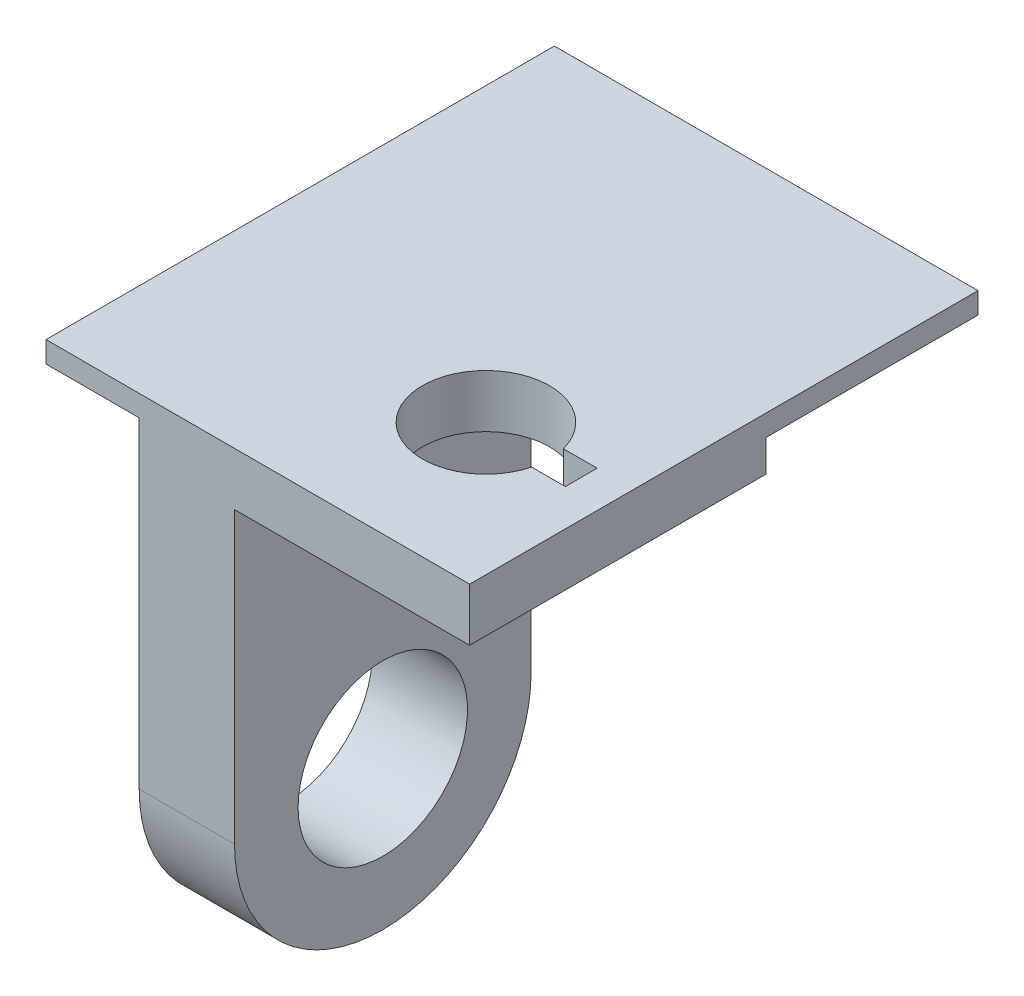
ISO-10303-21;
HEADER;
FILE_DESCRIPTION(('STEP AP214'),'2;1');
FILE_NAME('part.step','',(''),(''),'','','');
FILE_SCHEMA(('AUTOMOTIVE_DESIGN { 1 0 10303 214 1 1 1 1 }'));
ENDSEC;
DATA;
#1=APPLICATION_CONTEXT('core data for automotive mechanical design processes');
#2=APPLICATION_PROTOCOL_DEFINITION('international standard','automotive_design',2000,#1);
#3=PRODUCT_CONTEXT('',#1,'mechanical');
#4=PRODUCT('Part','Part','',(#3));
#5=PRODUCT_RELATED_PRODUCT_CATEGORY('part','',(#4));
#6=PRODUCT_DEFINITION_FORMATION('','',#4);
#7=PRODUCT_DEFINITION_CONTEXT('part definition',#1,'design');
#8=PRODUCT_DEFINITION('design','',#6,#7);
#9=PRODUCT_DEFINITION_SHAPE('','',#8);
#10=(LENGTH_UNIT() NAMED_UNIT(*) SI_UNIT(.MILLI.,.METRE.));
#11=(NAMED_UNIT(*) PLANE_ANGLE_UNIT() SI_UNIT($,.RADIAN.));
#12=(NAMED_UNIT(*) SI_UNIT($,.STERADIAN.) SOLID_ANGLE_UNIT());
#13=UNCERTAINTY_MEASURE_WITH_UNIT(LENGTH_MEASURE(1.E-05),#10,'distance_accuracy_value','');
#14=(GEOMETRIC_REPRESENTATION_CONTEXT(3) GLOBAL_UNCERTAINTY_ASSIGNED_CONTEXT((#13)) GLOBAL_UNIT_ASSIGNED_CONTEXT((#10,
#11,#12)) REPRESENTATION_CONTEXT('',''));
#15=CARTESIAN_POINT('',(0.,0.,0.));
#16=DIRECTION('',(0.,0.,1.));
#17=DIRECTION('',(1.,0.,0.));
#18=AXIS2_PLACEMENT_3D('',#15,#16,#17);
#19=CARTESIAN_POINT('',(0.,0.,0.));
#20=DIRECTION('',(1.,0.,0.));
#21=DIRECTION('',(0.,0.,-1.));
#22=AXIS2_PLACEMENT_3D('',#19,#20,#21);
#23=PLANE('',#22);
#24=CARTESIAN_POINT('',(0.,0.,0.));
#25=DIRECTION('',(1.,0.,0.));
#26=DIRECTION('',(0.,0.,-1.));
#27=AXIS2_PLACEMENT_3D('',#24,#25,#26);
#28=CIRCLE('',#27,40.);
#29=CARTESIAN_POINT('',(0.,0.,40.));
#30=VERTEX_POINT('',#29);
#31=EDGE_CURVE('E206',#30,#30,#28,.T.);
#32=ORIENTED_EDGE('',*,*,#31,.T.);
#33=EDGE_LOOP('',(#32));
#34=FACE_BOUND('',#33,.T.);
#35=DIRECTION('',(0.,0.,1.));
#36=VECTOR('',#35,1.);
#37=CARTESIAN_POINT('',(0.,151.8,0.));
#38=LINE('',#37,#36);
#39=CARTESIAN_POINT('',(0.,151.8,-70.));
#40=VERTEX_POINT('',#39);
#41=CARTESIAN_POINT('',(0.,151.8,70.));
#42=VERTEX_POINT('',#41);
#43=EDGE_CURVE('E57',#40,#42,#38,.T.);
#44=ORIENTED_EDGE('',*,*,#43,.F.);
#45=DIRECTION('',(0.,1.,0.));
#46=VECTOR('',#45,1.);
#47=CARTESIAN_POINT('',(0.,136.8,-70.));
#48=LINE('',#47,#46);
#49=CARTESIAN_POINT('',(0.,0.,-70.));
#50=VERTEX_POINT('',#49);
#51=EDGE_CURVE('E228',#50,#40,#48,.T.);
#52=ORIENTED_EDGE('',*,*,#51,.F.);
#53=CARTESIAN_POINT('',(0.,0.,0.));
#54=DIRECTION('',(1.,0.,0.));
#55=DIRECTION('',(0.,0.,-1.));
#56=AXIS2_PLACEMENT_3D('',#53,#54,#55);
#57=CIRCLE('',#56,70.);
#58=CARTESIAN_POINT('',(0.,0.,70.));
#59=VERTEX_POINT('',#58);
#60=EDGE_CURVE('E210',#59,#50,#57,.T.);
#61=ORIENTED_EDGE('',*,*,#60,.F.);
#62=DIRECTION('',(0.,-1.,0.));
#63=VECTOR('',#62,1.);
#64=CARTESIAN_POINT('',(0.,0.,70.));
#65=LINE('',#64,#63);
#66=EDGE_CURVE('E217',#42,#59,#65,.T.);
#67=ORIENTED_EDGE('',*,*,#66,.F.);
#68=EDGE_LOOP('',(#44,#52,#61,#67));
#69=FACE_BOUND('',#68,.T.);
#70=ADVANCED_FACE('F34',(#34,#69),#23,.F.);
#71=CARTESIAN_POINT('',(45.,136.8,-70.));
#72=DIRECTION('',(0.,0.,1.));
#73=DIRECTION('',(1.,0.,0.));
#74=AXIS2_PLACEMENT_3D('',#71,#72,#73);
#75=PLANE('',#74);
#76=DIRECTION('',(-1.,0.,0.));
#77=VECTOR('',#76,1.);
#78=CARTESIAN_POINT('',(0.,151.8,-70.));
#79=LINE('',#78,#77);
#80=CARTESIAN_POINT('',(156.,151.8,-70.));
#81=VERTEX_POINT('',#80);
#82=EDGE_CURVE('E169',#81,#40,#79,.T.);
#83=ORIENTED_EDGE('',*,*,#82,.F.);
#84=DIRECTION('',(0.,-1.,0.));
#85=VECTOR('',#84,1.);
#86=CARTESIAN_POINT('',(156.,161.8,-70.));
#87=LINE('',#86,#85);
#88=CARTESIAN_POINT('',(156.,136.8,-70.));
#89=VERTEX_POINT('',#88);
#90=EDGE_CURVE('E195',#81,#89,#87,.T.);
#91=ORIENTED_EDGE('',*,*,#90,.T.);
#92=DIRECTION('',(-1.,0.,0.));
#93=VECTOR('',#92,1.);
#94=CARTESIAN_POINT('',(0.,136.8,-70.));
#95=LINE('',#94,#93);
#96=CARTESIAN_POINT('',(45.,136.8,-70.));
#97=VERTEX_POINT('',#96);
#98=EDGE_CURVE('E193',#89,#97,#95,.T.);
#99=ORIENTED_EDGE('',*,*,#98,.T.);
#100=DIRECTION('',(0.,1.,0.));
#101=VECTOR('',#100,1.);
#102=CARTESIAN_POINT('',(45.,136.8,-70.));
#103=LINE('',#102,#101);
#104=CARTESIAN_POINT('',(45.,0.,-70.));
#105=VERTEX_POINT('',#104);
#106=EDGE_CURVE('E216',#105,#97,#103,.T.);
#107=ORIENTED_EDGE('',*,*,#106,.F.);
#108=DIRECTION('',(-1.,0.,0.));
#109=VECTOR('',#108,1.);
#110=CARTESIAN_POINT('',(45.,0.,-70.));
#111=LINE('',#110,#109);
#112=EDGE_CURVE('E233',#105,#50,#111,.T.);
#113=ORIENTED_EDGE('',*,*,#112,.T.);
#114=ORIENTED_EDGE('',*,*,#51,.T.);
#115=EDGE_LOOP('',(#83,#91,#99,#107,#113,#114));
#116=FACE_BOUND('',#115,.T.);
#117=ADVANCED_FACE('F238',(#116),#75,.F.);
#118=CARTESIAN_POINT('',(45.,0.,0.));
#119=DIRECTION('',(1.,0.,0.));
#120=DIRECTION('',(0.,0.,-1.));
#121=AXIS2_PLACEMENT_3D('',#118,#119,#120);
#122=PLANE('',#121);
#123=CARTESIAN_POINT('',(45.,0.,0.));
#124=DIRECTION('',(1.,0.,0.));
#125=DIRECTION('',(0.,0.,-1.));
#126=AXIS2_PLACEMENT_3D('',#123,#124,#125);
#127=CIRCLE('',#126,70.);
#128=CARTESIAN_POINT('',(45.,0.,70.));
#129=VERTEX_POINT('',#128);
#130=EDGE_CURVE('E213',#129,#105,#127,.T.);
#131=ORIENTED_EDGE('',*,*,#130,.T.);
#132=ORIENTED_EDGE('',*,*,#106,.T.);
#133=DIRECTION('',(0.,0.,1.));
#134=VECTOR('',#133,1.);
#135=CARTESIAN_POINT('',(45.,136.8,70.));
#136=LINE('',#135,#134);
#137=CARTESIAN_POINT('',(45.,136.8,70.));
#138=VERTEX_POINT('',#137);
#139=EDGE_CURVE('E220',#97,#138,#136,.T.);
#140=ORIENTED_EDGE('',*,*,#139,.T.);
#141=DIRECTION('',(0.,-1.,0.));
#142=VECTOR('',#141,1.);
#143=CARTESIAN_POINT('',(45.,0.,70.));
#144=LINE('',#143,#142);
#145=EDGE_CURVE('E223',#138,#129,#144,.T.);
#146=ORIENTED_EDGE('',*,*,#145,.T.);
#147=EDGE_LOOP('',(#131,#132,#140,#146));
#148=FACE_BOUND('',#147,.T.);
#149=CARTESIAN_POINT('',(45.,0.,0.));
#150=DIRECTION('',(1.,0.,0.));
#151=DIRECTION('',(0.,0.,-1.));
#152=AXIS2_PLACEMENT_3D('',#149,#150,#151);
#153=CIRCLE('',#152,40.);
#154=CARTESIAN_POINT('',(45.,0.,40.));
#155=VERTEX_POINT('',#154);
#156=EDGE_CURVE('E207',#155,#155,#153,.T.);
#157=ORIENTED_EDGE('',*,*,#156,.F.);
#158=EDGE_LOOP('',(#157));
#159=FACE_BOUND('',#158,.T.);
#160=ADVANCED_FACE('F267',(#148,#159),#122,.T.);
#161=CARTESIAN_POINT('',(45.,0.,0.));
#162=DIRECTION('',(-1.,0.,0.));
#163=DIRECTION('',(0.,0.,1.));
#164=AXIS2_PLACEMENT_3D('',#161,#162,#163);
#165=CYLINDRICAL_SURFACE('',#164,70.);
#166=ORIENTED_EDGE('',*,*,#60,.T.);
#167=ORIENTED_EDGE('',*,*,#112,.F.);
#168=ORIENTED_EDGE('',*,*,#130,.F.);
#169=DIRECTION('',(-1.,0.,0.));
#170=VECTOR('',#169,1.);
#171=CARTESIAN_POINT('',(45.,0.,70.));
#172=LINE('',#171,#170);
#173=EDGE_CURVE('E225',#129,#59,#172,.T.);
#174=ORIENTED_EDGE('',*,*,#173,.T.);
#175=EDGE_LOOP('',(#166,#167,#168,#174));
#176=FACE_BOUND('',#175,.T.);
#177=ADVANCED_FACE('F36',(#176),#165,.T.);
#178=CARTESIAN_POINT('',(45.,0.,70.));
#179=DIRECTION('',(0.,0.,-1.));
#180=DIRECTION('',(-1.,0.,0.));
#181=AXIS2_PLACEMENT_3D('',#178,#179,#180);
#182=PLANE('',#181);
#183=DIRECTION('',(1.,0.,0.));
#184=VECTOR('',#183,1.);
#185=CARTESIAN_POINT('',(0.,161.8,70.));
#186=LINE('',#185,#184);
#187=CARTESIAN_POINT('',(-44.,161.8,70.));
#188=VERTEX_POINT('',#187);
#189=CARTESIAN_POINT('',(156.,161.8,70.));
#190=VERTEX_POINT('',#189);
#191=EDGE_CURVE('E190',#188,#190,#186,.T.);
#192=ORIENTED_EDGE('',*,*,#191,.F.);
#193=DIRECTION('',(0.,1.,0.));
#194=VECTOR('',#193,1.);
#195=CARTESIAN_POINT('',(-44.,151.8,70.));
#196=LINE('',#195,#194);
#197=CARTESIAN_POINT('',(-44.,151.8,70.));
#198=VERTEX_POINT('',#197);
#199=EDGE_CURVE('E177',#198,#188,#196,.T.);
#200=ORIENTED_EDGE('',*,*,#199,.F.);
#201=DIRECTION('',(-1.,0.,0.));
#202=VECTOR('',#201,1.);
#203=CARTESIAN_POINT('',(0.,151.8,70.));
#204=LINE('',#203,#202);
#205=EDGE_CURVE('E166',#42,#198,#204,.T.);
#206=ORIENTED_EDGE('',*,*,#205,.F.);
#207=ORIENTED_EDGE('',*,*,#66,.T.);
#208=ORIENTED_EDGE('',*,*,#173,.F.);
#209=ORIENTED_EDGE('',*,*,#145,.F.);
#210=DIRECTION('',(1.,0.,0.));
#211=VECTOR('',#210,1.);
#212=CARTESIAN_POINT('',(0.,136.8,70.));
#213=LINE('',#212,#211);
#214=CARTESIAN_POINT('',(156.,136.8,70.));
#215=VERTEX_POINT('',#214);
#216=EDGE_CURVE('E187',#138,#215,#213,.T.);
#217=ORIENTED_EDGE('',*,*,#216,.T.);
#218=DIRECTION('',(0.,-1.,0.));
#219=VECTOR('',#218,1.);
#220=CARTESIAN_POINT('',(156.,161.8,70.));
#221=LINE('',#220,#219);
#222=EDGE_CURVE('E203',#190,#215,#221,.T.);
#223=ORIENTED_EDGE('',*,*,#222,.F.);
#224=EDGE_LOOP('',(#192,#200,#206,#207,#208,#209,#217,#223));
#225=FACE_BOUND('',#224,.T.);
#226=ADVANCED_FACE('F248',(#225),#182,.F.);
#227=CARTESIAN_POINT('',(45.,0.,0.));
#228=DIRECTION('',(-1.,0.,0.));
#229=DIRECTION('',(0.,0.,1.));
#230=AXIS2_PLACEMENT_3D('',#227,#228,#229);
#231=CYLINDRICAL_SURFACE('',#230,40.);
#232=CARTESIAN_POINT('',(45.,0.,40.));
#233=CARTESIAN_POINT('',(44.53125,0.,40.));
#234=CARTESIAN_POINT('',(44.0625,0.,40.));
#235=CARTESIAN_POINT('',(43.125,0.,40.));
#236=CARTESIAN_POINT('',(42.65625,0.,40.));
#237=CARTESIAN_POINT('',(41.71875,0.,40.));
#238=CARTESIAN_POINT('',(41.25,0.,40.));
#239=CARTESIAN_POINT('',(40.3125,0.,40.));
#240=CARTESIAN_POINT('',(39.84375,0.,40.));
#241=CARTESIAN_POINT('',(38.90625,0.,40.));
#242=CARTESIAN_POINT('',(38.4375,0.,40.));
#243=CARTESIAN_POINT('',(37.5,0.,40.));
#244=CARTESIAN_POINT('',(37.03125,0.,40.));
#245=CARTESIAN_POINT('',(36.09375,0.,40.));
#246=CARTESIAN_POINT('',(35.625,0.,40.));
#247=CARTESIAN_POINT('',(34.6875,0.,40.));
#248=CARTESIAN_POINT('',(34.21875,0.,40.));
#249=CARTESIAN_POINT('',(33.28125,0.,40.));
#250=CARTESIAN_POINT('',(32.8125,0.,40.));
#251=CARTESIAN_POINT('',(31.875,0.,40.));
#252=CARTESIAN_POINT('',(31.40625,0.,40.));
#253=CARTESIAN_POINT('',(30.46875,0.,40.));
#254=CARTESIAN_POINT('',(30.,0.,40.));
#255=CARTESIAN_POINT('',(29.0625,0.,40.));
#256=CARTESIAN_POINT('',(28.59375,0.,40.));
#257=CARTESIAN_POINT('',(27.65625,0.,40.));
#258=CARTESIAN_POINT('',(27.1875,0.,40.));
#259=CARTESIAN_POINT('',(26.25,0.,40.));
#260=CARTESIAN_POINT('',(25.78125,0.,40.));
#261=CARTESIAN_POINT('',(24.84375,0.,40.));
#262=CARTESIAN_POINT('',(24.375,0.,40.));
#263=CARTESIAN_POINT('',(23.4375,0.,40.));
#264=CARTESIAN_POINT('',(22.96875,0.,40.));
#265=CARTESIAN_POINT('',(22.03125,0.,40.));
#266=CARTESIAN_POINT('',(21.5625,0.,40.));
#267=CARTESIAN_POINT('',(20.625,0.,40.));
#268=CARTESIAN_POINT('',(20.15625,0.,40.));
#269=CARTESIAN_POINT('',(19.21875,0.,40.));
#270=CARTESIAN_POINT('',(18.75,0.,40.));
#271=CARTESIAN_POINT('',(17.8125,0.,40.));
#272=CARTESIAN_POINT('',(17.34375,0.,40.));
#273=CARTESIAN_POINT('',(16.40625,0.,40.));
#274=CARTESIAN_POINT('',(15.9375,0.,40.));
#275=CARTESIAN_POINT('',(15.,0.,40.));
#276=CARTESIAN_POINT('',(14.53125,0.,40.));
#277=CARTESIAN_POINT('',(13.59375,0.,40.));
#278=CARTESIAN_POINT('',(13.125,0.,40.));
#279=CARTESIAN_POINT('',(12.1875,0.,40.));
#280=CARTESIAN_POINT('',(11.71875,0.,40.));
#281=CARTESIAN_POINT('',(10.78125,0.,40.));
#282=CARTESIAN_POINT('',(10.3125,0.,40.));
#283=CARTESIAN_POINT('',(9.375,0.,40.));
#284=CARTESIAN_POINT('',(8.90625,0.,40.));
#285=CARTESIAN_POINT('',(7.96874999999999,0.,40.));
#286=CARTESIAN_POINT('',(7.5,0.,40.));
#287=CARTESIAN_POINT('',(6.5625,0.,40.));
#288=CARTESIAN_POINT('',(6.09375,0.,40.));
#289=CARTESIAN_POINT('',(5.15625,0.,40.));
#290=CARTESIAN_POINT('',(4.68749999999999,0.,40.));
#291=CARTESIAN_POINT('',(3.74999999999999,0.,40.));
#292=CARTESIAN_POINT('',(3.28124999999999,0.,40.));
#293=CARTESIAN_POINT('',(2.34374999999999,0.,40.));
#294=CARTESIAN_POINT('',(1.87499999999999,0.,40.));
#295=CARTESIAN_POINT('',(0.937499999999992,0.,40.));
#296=CARTESIAN_POINT('',(0.468749999999993,0.,40.));
#297=CARTESIAN_POINT('',(0.,0.,40.));
#298=B_SPLINE_CURVE_WITH_KNOTS('',3,(#232,#233,#234,#235,#236,#237,#238,#239,#240,#241,#242,
#243,#244,#245,#246,#247,#248,#249,#250,#251,#252,#253,#254,#255,#256,#257,#258,#259,#260,#261,
#262,#263,#264,#265,#266,#267,#268,#269,#270,#271,#272,#273,#274,#275,#276,#277,#278,#279,#280,
#281,#282,#283,#284,#285,#286,#287,#288,#289,#290,#291,#292,#293,#294,#295,#296,#297),
.UNSPECIFIED.,.F.,.F.,(4,2,2,2,2,2,2,2,2,2,2,2,2,2,2,2,2,2,2,2,2,2,2,2,2,2,2,2,2,2,2,2,4),(0.,
1.40625,2.8125,4.21875000000001,5.62500000000001,7.03125,8.4375,9.84375000000001,11.25,12.65625,
14.0625,15.46875,16.875,18.28125,19.6875,21.09375,22.5,23.90625,25.3125,26.71875,28.125,
29.53125,30.9375,32.34375,33.75,35.15625,36.5625,37.96875,39.375,40.78125,42.1875,43.59375,45.),.UNSPECIFIED.);
#299=EDGE_CURVE('BSEAM302',#155,#30,#298,.T.);
#300=ORIENTED_EDGE('',*,*,#156,.T.);
#301=ORIENTED_EDGE('',*,*,#31,.F.);
#302=ORIENTED_EDGE('',*,*,#299,.T.);
#303=ORIENTED_EDGE('',*,*,#299,.F.);
#304=EDGE_LOOP('',(#300,#302,#301,#303));
#305=FACE_BOUND('',#304,.T.);
#306=ADVANCED_FACE('F302',(#305),#231,.F.);
#307=CARTESIAN_POINT('',(0.,161.8,0.));
#308=DIRECTION('',(0.,1.,0.));
#309=DIRECTION('',(0.,0.,1.));
#310=AXIS2_PLACEMENT_3D('',#307,#308,#309);
#311=PLANE('',#310);
#312=DIRECTION('',(-1.,0.,0.));
#313=VECTOR('',#312,1.);
#314=CARTESIAN_POINT('',(138.7,161.8,-7.50000000000054));
#315=LINE('',#314,#313);
#316=CARTESIAN_POINT('',(138.7,161.8,-7.50000000000054));
#317=VERTEX_POINT('',#316);
#318=CARTESIAN_POINT('',(122.747375096556,161.8,-7.50000000000053));
#319=VERTEX_POINT('',#318);
#320=EDGE_CURVE('E145',#317,#319,#315,.T.);
#321=ORIENTED_EDGE('',*,*,#320,.F.);
#322=DIRECTION('',(0.,0.,-1.));
#323=VECTOR('',#322,1.);
#324=CARTESIAN_POINT('',(138.7,161.8,-7.50000000000054));
#325=LINE('',#324,#323);
#326=CARTESIAN_POINT('',(138.7,161.8,7.49999999999946));
#327=VERTEX_POINT('',#326);
#328=EDGE_CURVE('E135',#327,#317,#325,.T.);
#329=ORIENTED_EDGE('',*,*,#328,.F.);
#330=DIRECTION('',(1.,0.,0.));
#331=VECTOR('',#330,1.);
#332=CARTESIAN_POINT('',(138.7,161.8,7.49999999999946));
#333=LINE('',#332,#331);
#334=CARTESIAN_POINT('',(122.747375096556,161.8,7.49999999999946));
#335=VERTEX_POINT('',#334);
#336=EDGE_CURVE('E127',#335,#327,#333,.T.);
#337=ORIENTED_EDGE('',*,*,#336,.F.);
#338=CARTESIAN_POINT('',(93.7,161.8,-4.69651297754447E-13));
#339=DIRECTION('',(0.,1.,0.));
#340=DIRECTION('',(0.,0.,1.));
#341=AXIS2_PLACEMENT_3D('',#338,#339,#340);
#342=CIRCLE('',#341,30.);
#343=EDGE_CURVE('E185',#319,#335,#342,.T.);
#344=ORIENTED_EDGE('',*,*,#343,.F.);
#345=EDGE_LOOP('',(#321,#329,#337,#344));
#346=FACE_BOUND('',#345,.T.);
#347=DIRECTION('',(0.,0.,-1.));
#348=VECTOR('',#347,1.);
#349=CARTESIAN_POINT('',(156.,161.8,-70.));
#350=LINE('',#349,#348);
#351=CARTESIAN_POINT('',(156.,161.8,-170.));
#352=VERTEX_POINT('',#351);
#353=EDGE_CURVE('E192',#190,#352,#350,.T.);
#354=ORIENTED_EDGE('',*,*,#353,.T.);
#355=DIRECTION('',(-1.,0.,0.));
#356=VECTOR('',#355,1.);
#357=CARTESIAN_POINT('',(0.,161.8,-170.));
#358=LINE('',#357,#356);
#359=CARTESIAN_POINT('',(-44.,161.8,-170.));
#360=VERTEX_POINT('',#359);
#361=EDGE_CURVE('E155',#352,#360,#358,.T.);
#362=ORIENTED_EDGE('',*,*,#361,.T.);
#363=DIRECTION('',(0.,0.,-1.));
#364=VECTOR('',#363,1.);
#365=CARTESIAN_POINT('',(-44.,161.8,0.));
#366=LINE('',#365,#364);
#367=EDGE_CURVE('E161',#188,#360,#366,.T.);
#368=ORIENTED_EDGE('',*,*,#367,.F.);
#369=ORIENTED_EDGE('',*,*,#191,.T.);
#370=EDGE_LOOP('',(#354,#362,#368,#369));
#371=FACE_BOUND('',#370,.T.);
#372=ADVANCED_FACE('F147',(#346,#371),#311,.T.);
#373=CARTESIAN_POINT('',(0.,136.8,0.));
#374=DIRECTION('',(0.,1.,0.));
#375=DIRECTION('',(0.,0.,1.));
#376=AXIS2_PLACEMENT_3D('',#373,#374,#375);
#377=PLANE('',#376);
#378=ORIENTED_EDGE('',*,*,#139,.F.);
#379=ORIENTED_EDGE('',*,*,#98,.F.);
#380=DIRECTION('',(0.,0.,-1.));
#381=VECTOR('',#380,1.);
#382=CARTESIAN_POINT('',(156.,136.8,-70.));
#383=LINE('',#382,#381);
#384=EDGE_CURVE('E197',#215,#89,#383,.T.);
#385=ORIENTED_EDGE('',*,*,#384,.F.);
#386=ORIENTED_EDGE('',*,*,#216,.F.);
#387=EDGE_LOOP('',(#378,#379,#385,#386));
#388=FACE_BOUND('',#387,.T.);
#389=DIRECTION('',(0.,0.,1.));
#390=VECTOR('',#389,1.);
#391=CARTESIAN_POINT('',(138.7,136.8,-7.50000000000054));
#392=LINE('',#391,#390);
#393=CARTESIAN_POINT('',(138.7,136.8,-7.50000000000054));
#394=VERTEX_POINT('',#393);
#395=CARTESIAN_POINT('',(138.7,136.8,7.49999999999946));
#396=VERTEX_POINT('',#395);
#397=EDGE_CURVE('E143',#394,#396,#392,.T.);
#398=ORIENTED_EDGE('',*,*,#397,.F.);
#399=DIRECTION('',(1.,0.,0.));
#400=VECTOR('',#399,1.);
#401=CARTESIAN_POINT('',(138.7,136.8,-7.50000000000054));
#402=LINE('',#401,#400);
#403=CARTESIAN_POINT('',(122.747375096556,136.8,-7.50000000000053));
#404=VERTEX_POINT('',#403);
#405=EDGE_CURVE('E156',#404,#394,#402,.T.);
#406=ORIENTED_EDGE('',*,*,#405,.F.);
#407=CARTESIAN_POINT('',(93.7,136.8,-4.69651297754447E-13));
#408=DIRECTION('',(0.,1.,0.));
#409=DIRECTION('',(0.,0.,1.));
#410=AXIS2_PLACEMENT_3D('',#407,#408,#409);
#411=CIRCLE('',#410,30.);
#412=CARTESIAN_POINT('',(122.747375096556,136.8,7.49999999999947));
#413=VERTEX_POINT('',#412);
#414=EDGE_CURVE('E180',#404,#413,#411,.T.);
#415=ORIENTED_EDGE('',*,*,#414,.T.);
#416=DIRECTION('',(-1.,0.,0.));
#417=VECTOR('',#416,1.);
#418=CARTESIAN_POINT('',(138.7,136.8,7.49999999999946));
#419=LINE('',#418,#417);
#420=EDGE_CURVE('E49',#396,#413,#419,.T.);
#421=ORIENTED_EDGE('',*,*,#420,.F.);
#422=EDGE_LOOP('',(#398,#406,#415,#421));
#423=FACE_BOUND('',#422,.T.);
#424=ADVANCED_FACE('F270',(#388,#423),#377,.F.);
#425=CARTESIAN_POINT('',(156.,161.8,-70.));
#426=DIRECTION('',(-1.,0.,0.));
#427=DIRECTION('',(0.,0.,1.));
#428=AXIS2_PLACEMENT_3D('',#425,#426,#427);
#429=PLANE('',#428);
#430=ORIENTED_EDGE('',*,*,#384,.T.);
#431=ORIENTED_EDGE('',*,*,#90,.F.);
#432=DIRECTION('',(0.,0.,1.));
#433=VECTOR('',#432,1.);
#434=CARTESIAN_POINT('',(156.,151.8,0.));
#435=LINE('',#434,#433);
#436=CARTESIAN_POINT('',(156.,151.8,-170.));
#437=VERTEX_POINT('',#436);
#438=EDGE_CURVE('E157',#437,#81,#435,.T.);
#439=ORIENTED_EDGE('',*,*,#438,.F.);
#440=DIRECTION('',(0.,1.,0.));
#441=VECTOR('',#440,1.);
#442=CARTESIAN_POINT('',(156.,151.8,-170.));
#443=LINE('',#442,#441);
#444=EDGE_CURVE('E172',#437,#352,#443,.T.);
#445=ORIENTED_EDGE('',*,*,#444,.T.);
#446=ORIENTED_EDGE('',*,*,#353,.F.);
#447=ORIENTED_EDGE('',*,*,#222,.T.);
#448=EDGE_LOOP('',(#430,#431,#439,#445,#446,#447));
#449=FACE_BOUND('',#448,.T.);
#450=ADVANCED_FACE('F262',(#449),#429,.F.);
#451=CARTESIAN_POINT('',(93.7,161.8,-4.69651297754447E-13));
#452=DIRECTION('',(0.,-1.,0.));
#453=DIRECTION('',(0.,0.,-1.));
#454=AXIS2_PLACEMENT_3D('',#451,#452,#453);
#455=CYLINDRICAL_SURFACE('',#454,30.);
#456=DIRECTION('',(0.,-1.,0.));
#457=VECTOR('',#456,1.);
#458=CARTESIAN_POINT('',(122.747375096556,161.8,-7.50000000000053));
#459=LINE('',#458,#457);
#460=EDGE_CURVE('E11',#319,#404,#459,.T.);
#461=ORIENTED_EDGE('',*,*,#460,.F.);
#462=ORIENTED_EDGE('',*,*,#343,.T.);
#463=DIRECTION('',(0.,-1.,0.));
#464=VECTOR('',#463,1.);
#465=CARTESIAN_POINT('',(122.747375096556,161.8,7.49999999999947));
#466=LINE('',#465,#464);
#467=EDGE_CURVE('E42',#413,#335,#466,.F.);
#468=ORIENTED_EDGE('',*,*,#467,.F.);
#469=ORIENTED_EDGE('',*,*,#414,.F.);
#470=EDGE_LOOP('',(#461,#462,#468,#469));
#471=FACE_BOUND('',#470,.T.);
#472=ADVANCED_FACE('F281',(#471),#455,.F.);
#473=CARTESIAN_POINT('',(-44.,151.8,0.));
#474=DIRECTION('',(1.,0.,0.));
#475=DIRECTION('',(0.,0.,-1.));
#476=AXIS2_PLACEMENT_3D('',#473,#474,#475);
#477=PLANE('',#476);
#478=ORIENTED_EDGE('',*,*,#367,.T.);
#479=DIRECTION('',(0.,1.,0.));
#480=VECTOR('',#479,1.);
#481=CARTESIAN_POINT('',(-44.,151.8,-170.));
#482=LINE('',#481,#480);
#483=CARTESIAN_POINT('',(-44.,151.8,-170.));
#484=VERTEX_POINT('',#483);
#485=EDGE_CURVE('E181',#484,#360,#482,.T.);
#486=ORIENTED_EDGE('',*,*,#485,.F.);
#487=DIRECTION('',(0.,0.,-1.));
#488=VECTOR('',#487,1.);
#489=CARTESIAN_POINT('',(-44.,151.8,0.));
#490=LINE('',#489,#488);
#491=EDGE_CURVE('E164',#198,#484,#490,.T.);
#492=ORIENTED_EDGE('',*,*,#491,.F.);
#493=ORIENTED_EDGE('',*,*,#199,.T.);
#494=EDGE_LOOP('',(#478,#486,#492,#493));
#495=FACE_BOUND('',#494,.T.);
#496=ADVANCED_FACE('F254',(#495),#477,.F.);
#497=CARTESIAN_POINT('',(0.,151.8,-170.));
#498=DIRECTION('',(0.,0.,-1.));
#499=DIRECTION('',(-1.,0.,0.));
#500=AXIS2_PLACEMENT_3D('',#497,#498,#499);
#501=PLANE('',#500);
#502=ORIENTED_EDGE('',*,*,#361,.F.);
#503=ORIENTED_EDGE('',*,*,#444,.F.);
#504=DIRECTION('',(-1.,0.,0.));
#505=VECTOR('',#504,1.);
#506=CARTESIAN_POINT('',(0.,151.8,-170.));
#507=LINE('',#506,#505);
#508=EDGE_CURVE('E160',#437,#484,#507,.T.);
#509=ORIENTED_EDGE('',*,*,#508,.T.);
#510=ORIENTED_EDGE('',*,*,#485,.T.);
#511=EDGE_LOOP('',(#502,#503,#509,#510));
#512=FACE_BOUND('',#511,.T.);
#513=ADVANCED_FACE('F259',(#512),#501,.T.);
#514=CARTESIAN_POINT('',(0.,151.8,0.));
#515=DIRECTION('',(0.,1.,0.));
#516=DIRECTION('',(0.,0.,1.));
#517=AXIS2_PLACEMENT_3D('',#514,#515,#516);
#518=PLANE('',#517);
#519=ORIENTED_EDGE('',*,*,#438,.T.);
#520=ORIENTED_EDGE('',*,*,#82,.T.);
#521=ORIENTED_EDGE('',*,*,#43,.T.);
#522=ORIENTED_EDGE('',*,*,#205,.T.);
#523=ORIENTED_EDGE('',*,*,#491,.T.);
#524=ORIENTED_EDGE('',*,*,#508,.F.);
#525=EDGE_LOOP('',(#519,#520,#521,#522,#523,#524));
#526=FACE_BOUND('',#525,.T.);
#527=ADVANCED_FACE('F246',(#526),#518,.F.);
#528=CARTESIAN_POINT('',(138.7,89.3658350974743,-7.50000000000054));
#529=DIRECTION('',(0.,0.,-1.));
#530=DIRECTION('',(-1.,0.,0.));
#531=AXIS2_PLACEMENT_3D('',#528,#529,#530);
#532=PLANE('',#531);
#533=ORIENTED_EDGE('',*,*,#460,.T.);
#534=ORIENTED_EDGE('',*,*,#405,.T.);
#535=DIRECTION('',(0.,1.,0.));
#536=VECTOR('',#535,1.);
#537=CARTESIAN_POINT('',(138.7,89.3658350974743,-7.50000000000054));
#538=LINE('',#537,#536);
#539=EDGE_CURVE('E144',#394,#317,#538,.T.);
#540=ORIENTED_EDGE('',*,*,#539,.T.);
#541=ORIENTED_EDGE('',*,*,#320,.T.);
#542=EDGE_LOOP('',(#533,#534,#540,#541));
#543=FACE_BOUND('',#542,.T.);
#544=ADVANCED_FACE('F278',(#543),#532,.F.);
#545=CARTESIAN_POINT('',(138.7,89.3658350974743,-7.50000000000054));
#546=DIRECTION('',(1.,0.,0.));
#547=DIRECTION('',(0.,0.,-1.));
#548=AXIS2_PLACEMENT_3D('',#545,#546,#547);
#549=PLANE('',#548);
#550=ORIENTED_EDGE('',*,*,#397,.T.);
#551=DIRECTION('',(0.,1.,0.));
#552=VECTOR('',#551,1.);
#553=CARTESIAN_POINT('',(138.7,89.3658350974743,7.49999999999946));
#554=LINE('',#553,#552);
#555=EDGE_CURVE('E130',#396,#327,#554,.T.);
#556=ORIENTED_EDGE('',*,*,#555,.T.);
#557=ORIENTED_EDGE('',*,*,#328,.T.);
#558=ORIENTED_EDGE('',*,*,#539,.F.);
#559=EDGE_LOOP('',(#550,#556,#557,#558));
#560=FACE_BOUND('',#559,.T.);
#561=ADVANCED_FACE('F139',(#560),#549,.F.);
#562=CARTESIAN_POINT('',(138.7,89.3658350974743,7.49999999999946));
#563=DIRECTION('',(0.,0.,1.));
#564=DIRECTION('',(1.,0.,0.));
#565=AXIS2_PLACEMENT_3D('',#562,#563,#564);
#566=PLANE('',#565);
#567=ORIENTED_EDGE('',*,*,#467,.T.);
#568=ORIENTED_EDGE('',*,*,#336,.T.);
#569=ORIENTED_EDGE('',*,*,#555,.F.);
#570=ORIENTED_EDGE('',*,*,#420,.T.);
#571=EDGE_LOOP('',(#567,#568,#569,#570));
#572=FACE_BOUND('',#571,.T.);
#573=ADVANCED_FACE('F129',(#572),#566,.F.);
#574=CLOSED_SHELL('',(#70,#117,#160,#177,#226,#306,#372,#424,#450,#472,#496,#513,#527,#544,#561,#573));
#575=MANIFOLD_SOLID_BREP('B2',#574);
#576=ADVANCED_BREP_SHAPE_REPRESENTATION('',(#18,#575),#14);
#577=SHAPE_DEFINITION_REPRESENTATION(#9,#576);
ENDSEC;
END-ISO-10303-21;
